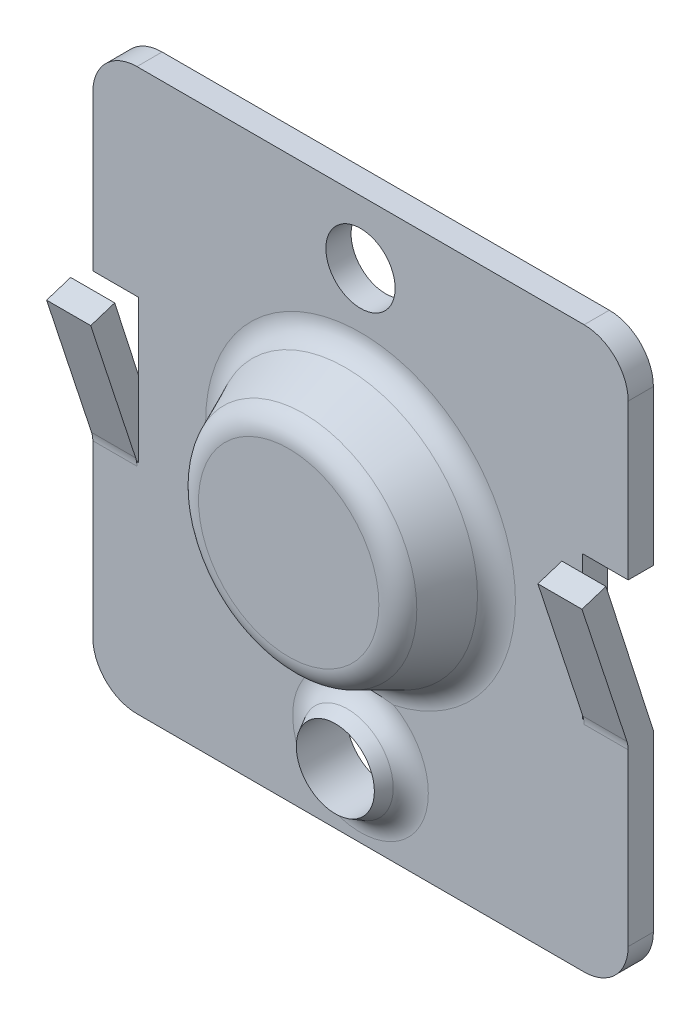
ISO-10303-21;
HEADER;
FILE_DESCRIPTION(('STEP AP214'),'2;1');
FILE_NAME('part.step','',(''),(''),'','','');
FILE_SCHEMA(('AUTOMOTIVE_DESIGN { 1 0 10303 214 1 1 1 1 }'));
ENDSEC;
DATA;
#1=APPLICATION_CONTEXT('core data for automotive mechanical design processes');
#2=APPLICATION_PROTOCOL_DEFINITION('international standard','automotive_design',2000,#1);
#3=PRODUCT_CONTEXT('',#1,'mechanical');
#4=PRODUCT('Part','Part','',(#3));
#5=PRODUCT_RELATED_PRODUCT_CATEGORY('part','',(#4));
#6=PRODUCT_DEFINITION_FORMATION('','',#4);
#7=PRODUCT_DEFINITION_CONTEXT('part definition',#1,'design');
#8=PRODUCT_DEFINITION('design','',#6,#7);
#9=PRODUCT_DEFINITION_SHAPE('','',#8);
#10=(LENGTH_UNIT() NAMED_UNIT(*) SI_UNIT(.MILLI.,.METRE.));
#11=(NAMED_UNIT(*) PLANE_ANGLE_UNIT() SI_UNIT($,.RADIAN.));
#12=(NAMED_UNIT(*) SI_UNIT($,.STERADIAN.) SOLID_ANGLE_UNIT());
#13=UNCERTAINTY_MEASURE_WITH_UNIT(LENGTH_MEASURE(1.E-05),#10,'distance_accuracy_value','');
#14=(GEOMETRIC_REPRESENTATION_CONTEXT(3) GLOBAL_UNCERTAINTY_ASSIGNED_CONTEXT((#13)) GLOBAL_UNIT_ASSIGNED_CONTEXT((#10,
#11,#12)) REPRESENTATION_CONTEXT('',''));
#15=CARTESIAN_POINT('',(0.,0.,0.));
#16=DIRECTION('',(0.,0.,1.));
#17=DIRECTION('',(1.,0.,0.));
#18=AXIS2_PLACEMENT_3D('',#15,#16,#17);
#19=CARTESIAN_POINT('',(0.889,10.414,0.508));
#20=DIRECTION('',(0.,0.,-1.));
#21=DIRECTION('',(-1.,0.,0.));
#22=AXIS2_PLACEMENT_3D('',#19,#20,#21);
#23=PLANE('',#22);
#24=CARTESIAN_POINT('',(5.3975,5.7912,0.508));
#25=DIRECTION('',(0.,0.,-1.));
#26=DIRECTION('',(-1.,0.,0.));
#27=AXIS2_PLACEMENT_3D('',#24,#25,#26);
#28=CIRCLE('',#27,3.12351811098683);
#29=CARTESIAN_POINT('',(8.52101811098683,5.7912,0.508));
#30=VERTEX_POINT('',#29);
#31=CARTESIAN_POINT('',(6.0686205800684,2.74063242056968,0.508));
#32=VERTEX_POINT('',#31);
#33=EDGE_CURVE('E334',#30,#32,#28,.T.);
#34=ORIENTED_EDGE('',*,*,#33,.T.);
#35=CARTESIAN_POINT('',(5.3975,1.5494,0.508));
#36=DIRECTION('',(0.,0.,-1.));
#37=DIRECTION('',(-1.,0.,0.));
#38=AXIS2_PLACEMENT_3D('',#35,#36,#37);
#39=CIRCLE('',#38,1.36727375196324);
#40=CARTESIAN_POINT('',(6.76477375196324,1.5494,0.508));
#41=VERTEX_POINT('',#40);
#42=EDGE_CURVE('E346',#32,#41,#39,.T.);
#43=ORIENTED_EDGE('',*,*,#42,.T.);
#44=CARTESIAN_POINT('',(5.3975,1.5494,0.508));
#45=DIRECTION('',(0.,0.,-1.));
#46=DIRECTION('',(-1.,0.,0.));
#47=AXIS2_PLACEMENT_3D('',#44,#45,#46);
#48=CIRCLE('',#47,1.36727375196324);
#49=CARTESIAN_POINT('',(4.72637941993159,2.74063242056968,0.508));
#50=VERTEX_POINT('',#49);
#51=EDGE_CURVE('E344',#41,#50,#48,.T.);
#52=ORIENTED_EDGE('',*,*,#51,.T.);
#53=CARTESIAN_POINT('',(5.3975,5.7912,0.508));
#54=DIRECTION('',(0.,0.,-1.));
#55=DIRECTION('',(-1.,0.,0.));
#56=AXIS2_PLACEMENT_3D('',#53,#54,#55);
#57=CIRCLE('',#56,3.12351811098683);
#58=EDGE_CURVE('E341',#50,#30,#57,.T.);
#59=ORIENTED_EDGE('',*,*,#58,.T.);
#60=EDGE_LOOP('',(#34,#43,#52,#59));
#61=FACE_BOUND('',#60,.T.);
#62=CARTESIAN_POINT('',(5.3975,10.033,0.508));
#63=DIRECTION('',(0.,0.,1.));
#64=DIRECTION('',(1.,0.,0.));
#65=AXIS2_PLACEMENT_3D('',#62,#63,#64);
#66=CIRCLE('',#65,0.698499999999999);
#67=CARTESIAN_POINT('',(6.096,10.033,0.508));
#68=VERTEX_POINT('',#67);
#69=EDGE_CURVE('E500',#68,#68,#66,.T.);
#70=ORIENTED_EDGE('',*,*,#69,.F.);
#71=EDGE_LOOP('',(#70));
#72=FACE_BOUND('',#71,.T.);
#73=DIRECTION('',(0.,1.,0.));
#74=VECTOR('',#73,1.);
#75=CARTESIAN_POINT('',(10.795,0.889000000000006,0.508));
#76=LINE('',#75,#74);
#77=CARTESIAN_POINT('',(10.795,0.889000000000006,0.508));
#78=VERTEX_POINT('',#77);
#79=CARTESIAN_POINT('',(10.795,4.32379097428765,0.508));
#80=VERTEX_POINT('',#79);
#81=EDGE_CURVE('E520',#78,#80,#76,.T.);
#82=ORIENTED_EDGE('',*,*,#81,.T.);
#83=DIRECTION('',(-1.,0.,0.));
#84=VECTOR('',#83,1.);
#85=CARTESIAN_POINT('',(0.889,4.32379097428765,0.508));
#86=LINE('',#85,#84);
#87=CARTESIAN_POINT('',(9.906,4.32379097428765,0.508));
#88=VERTEX_POINT('',#87);
#89=EDGE_CURVE('E355',#80,#88,#86,.T.);
#90=ORIENTED_EDGE('',*,*,#89,.T.);
#91=DIRECTION('',(0.,1.,0.));
#92=VECTOR('',#91,1.);
#93=CARTESIAN_POINT('',(9.906,10.414,0.508));
#94=LINE('',#93,#92);
#95=CARTESIAN_POINT('',(9.906,4.40500093457944,0.508));
#96=VERTEX_POINT('',#95);
#97=EDGE_CURVE('E353',#88,#96,#94,.T.);
#98=ORIENTED_EDGE('',*,*,#97,.T.);
#99=DIRECTION('',(-1.,0.,0.));
#100=VECTOR('',#99,1.);
#101=CARTESIAN_POINT('',(9.87154128838451,4.40500093457944,0.508));
#102=LINE('',#101,#100);
#103=CARTESIAN_POINT('',(9.87154128838451,4.40500093457944,0.508));
#104=VERTEX_POINT('',#103);
#105=EDGE_CURVE('E522',#96,#104,#102,.T.);
#106=ORIENTED_EDGE('',*,*,#105,.T.);
#107=DIRECTION('',(0.,1.,0.));
#108=VECTOR('',#107,1.);
#109=CARTESIAN_POINT('',(9.87154128838451,7.2898,0.508));
#110=LINE('',#109,#108);
#111=CARTESIAN_POINT('',(9.87154128838451,7.2898,0.508));
#112=VERTEX_POINT('',#111);
#113=EDGE_CURVE('E524',#104,#112,#110,.T.);
#114=ORIENTED_EDGE('',*,*,#113,.T.);
#115=DIRECTION('',(1.,0.,0.));
#116=VECTOR('',#115,1.);
#117=CARTESIAN_POINT('',(10.795,7.2898,0.508));
#118=LINE('',#117,#116);
#119=CARTESIAN_POINT('',(10.795,7.2898,0.508));
#120=VERTEX_POINT('',#119);
#121=EDGE_CURVE('E526',#112,#120,#118,.T.);
#122=ORIENTED_EDGE('',*,*,#121,.T.);
#123=DIRECTION('',(0.,1.,0.));
#124=VECTOR('',#123,1.);
#125=CARTESIAN_POINT('',(10.795,7.2898,0.508));
#126=LINE('',#125,#124);
#127=CARTESIAN_POINT('',(10.795,10.414,0.508));
#128=VERTEX_POINT('',#127);
#129=EDGE_CURVE('E528',#120,#128,#126,.T.);
#130=ORIENTED_EDGE('',*,*,#129,.T.);
#131=CARTESIAN_POINT('',(9.906,10.414,0.508));
#132=DIRECTION('',(0.,0.,1.));
#133=DIRECTION('',(-1.,0.,0.));
#134=AXIS2_PLACEMENT_3D('',#131,#132,#133);
#135=CIRCLE('',#134,0.888999999999999);
#136=CARTESIAN_POINT('',(9.90599999999999,11.303,0.508));
#137=VERTEX_POINT('',#136);
#138=EDGE_CURVE('E530',#128,#137,#135,.T.);
#139=ORIENTED_EDGE('',*,*,#138,.T.);
#140=DIRECTION('',(-1.,0.,0.));
#141=VECTOR('',#140,1.);
#142=CARTESIAN_POINT('',(0.889000000000006,11.303,0.508));
#143=LINE('',#142,#141);
#144=CARTESIAN_POINT('',(0.889000000000006,11.303,0.508));
#145=VERTEX_POINT('',#144);
#146=EDGE_CURVE('E531',#137,#145,#143,.T.);
#147=ORIENTED_EDGE('',*,*,#146,.T.);
#148=CARTESIAN_POINT('',(0.889,10.414,0.508));
#149=DIRECTION('',(0.,0.,1.));
#150=DIRECTION('',(-1.,0.,0.));
#151=AXIS2_PLACEMENT_3D('',#148,#149,#150);
#152=CIRCLE('',#151,0.889);
#153=CARTESIAN_POINT('',(0.,10.414,0.508));
#154=VERTEX_POINT('',#153);
#155=EDGE_CURVE('E452',#145,#154,#152,.T.);
#156=ORIENTED_EDGE('',*,*,#155,.T.);
#157=DIRECTION('',(0.,-1.,0.));
#158=VECTOR('',#157,1.);
#159=CARTESIAN_POINT('',(0.,7.2898,0.508));
#160=LINE('',#159,#158);
#161=CARTESIAN_POINT('',(0.,7.2898,0.508));
#162=VERTEX_POINT('',#161);
#163=EDGE_CURVE('E447',#154,#162,#160,.T.);
#164=ORIENTED_EDGE('',*,*,#163,.T.);
#165=DIRECTION('',(1.,0.,0.));
#166=VECTOR('',#165,1.);
#167=CARTESIAN_POINT('',(0.,7.2898,0.508));
#168=LINE('',#167,#166);
#169=CARTESIAN_POINT('',(0.923458711615487,7.2898,0.508));
#170=VERTEX_POINT('',#169);
#171=EDGE_CURVE('E492',#162,#170,#168,.T.);
#172=ORIENTED_EDGE('',*,*,#171,.T.);
#173=DIRECTION('',(0.,-1.,0.));
#174=VECTOR('',#173,1.);
#175=CARTESIAN_POINT('',(0.923458711615487,7.2898,0.508));
#176=LINE('',#175,#174);
#177=CARTESIAN_POINT('',(0.923458711615487,4.40500093457943,0.508));
#178=VERTEX_POINT('',#177);
#179=EDGE_CURVE('E394',#170,#178,#176,.T.);
#180=ORIENTED_EDGE('',*,*,#179,.T.);
#181=DIRECTION('',(-1.,0.,0.));
#182=VECTOR('',#181,1.);
#183=CARTESIAN_POINT('',(0.923458711615487,4.40500093457943,0.508));
#184=LINE('',#183,#182);
#185=CARTESIAN_POINT('',(0.889,4.40500093457943,0.508));
#186=VERTEX_POINT('',#185);
#187=EDGE_CURVE('E392',#178,#186,#184,.T.);
#188=ORIENTED_EDGE('',*,*,#187,.T.);
#189=DIRECTION('',(0.,-1.,0.));
#190=VECTOR('',#189,1.);
#191=CARTESIAN_POINT('',(0.889,10.414,0.508));
#192=LINE('',#191,#190);
#193=CARTESIAN_POINT('',(0.889,4.32379097428765,0.508));
#194=VERTEX_POINT('',#193);
#195=EDGE_CURVE('E61',#186,#194,#192,.T.);
#196=ORIENTED_EDGE('',*,*,#195,.T.);
#197=DIRECTION('',(-1.,0.,0.));
#198=VECTOR('',#197,1.);
#199=CARTESIAN_POINT('',(0.889,4.32379097428765,0.508));
#200=LINE('',#199,#198);
#201=CARTESIAN_POINT('',(0.,4.32379097428764,0.508));
#202=VERTEX_POINT('',#201);
#203=EDGE_CURVE('E350',#194,#202,#200,.T.);
#204=ORIENTED_EDGE('',*,*,#203,.T.);
#205=DIRECTION('',(0.,-1.,0.));
#206=VECTOR('',#205,1.);
#207=CARTESIAN_POINT('',(0.,0.889000000000006,0.508));
#208=LINE('',#207,#206);
#209=CARTESIAN_POINT('',(0.,0.889000000000006,0.508));
#210=VERTEX_POINT('',#209);
#211=EDGE_CURVE('E380',#202,#210,#208,.T.);
#212=ORIENTED_EDGE('',*,*,#211,.T.);
#213=CARTESIAN_POINT('',(0.889,0.889,0.508));
#214=DIRECTION('',(0.,0.,1.));
#215=DIRECTION('',(-1.,0.,0.));
#216=AXIS2_PLACEMENT_3D('',#213,#214,#215);
#217=CIRCLE('',#216,0.889);
#218=CARTESIAN_POINT('',(0.889000000000006,0.,0.508));
#219=VERTEX_POINT('',#218);
#220=EDGE_CURVE('E514',#210,#219,#217,.T.);
#221=ORIENTED_EDGE('',*,*,#220,.T.);
#222=DIRECTION('',(1.,0.,0.));
#223=VECTOR('',#222,1.);
#224=CARTESIAN_POINT('',(0.889000000000006,0.,0.508));
#225=LINE('',#224,#223);
#226=CARTESIAN_POINT('',(9.90599999999999,0.,0.508));
#227=VERTEX_POINT('',#226);
#228=EDGE_CURVE('E516',#219,#227,#225,.T.);
#229=ORIENTED_EDGE('',*,*,#228,.T.);
#230=CARTESIAN_POINT('',(9.906,0.889,0.508));
#231=DIRECTION('',(0.,0.,1.));
#232=DIRECTION('',(1.,0.,0.));
#233=AXIS2_PLACEMENT_3D('',#230,#231,#232);
#234=CIRCLE('',#233,0.889);
#235=EDGE_CURVE('E518',#227,#78,#234,.T.);
#236=ORIENTED_EDGE('',*,*,#235,.T.);
#237=EDGE_LOOP('',(#82,#90,#98,#106,#114,#122,#130,#139,#147,#156,#164,#172,#180,#188,#196,#204,
#212,#221,#229,#236));
#238=FACE_BOUND('',#237,.T.);
#239=ADVANCED_FACE('F41',(#61,#72,#238),#23,.F.);
#240=CARTESIAN_POINT('',(0.889,10.414,0.));
#241=DIRECTION('',(0.,0.,-1.));
#242=DIRECTION('',(-1.,0.,0.));
#243=AXIS2_PLACEMENT_3D('',#240,#241,#242);
#244=PLANE('',#243);
#245=CARTESIAN_POINT('',(5.3975,10.033,0.));
#246=DIRECTION('',(0.,0.,1.));
#247=DIRECTION('',(1.,0.,0.));
#248=AXIS2_PLACEMENT_3D('',#245,#246,#247);
#249=CIRCLE('',#248,0.698499999999999);
#250=CARTESIAN_POINT('',(6.096,10.033,0.));
#251=VERTEX_POINT('',#250);
#252=EDGE_CURVE('E504',#251,#251,#249,.T.);
#253=ORIENTED_EDGE('',*,*,#252,.T.);
#254=EDGE_LOOP('',(#253));
#255=FACE_BOUND('',#254,.T.);
#256=DIRECTION('',(0.,-1.,0.));
#257=VECTOR('',#256,1.);
#258=CARTESIAN_POINT('',(0.,7.2898,0.));
#259=LINE('',#258,#257);
#260=CARTESIAN_POINT('',(0.,10.414,0.));
#261=VERTEX_POINT('',#260);
#262=CARTESIAN_POINT('',(0.,7.2898,0.));
#263=VERTEX_POINT('',#262);
#264=EDGE_CURVE('E496',#261,#263,#259,.T.);
#265=ORIENTED_EDGE('',*,*,#264,.F.);
#266=CARTESIAN_POINT('',(0.889,10.414,0.));
#267=DIRECTION('',(0.,0.,1.));
#268=DIRECTION('',(-1.,0.,0.));
#269=AXIS2_PLACEMENT_3D('',#266,#267,#268);
#270=CIRCLE('',#269,0.889);
#271=CARTESIAN_POINT('',(0.889000000000006,11.303,0.));
#272=VERTEX_POINT('',#271);
#273=EDGE_CURVE('E445',#272,#261,#270,.T.);
#274=ORIENTED_EDGE('',*,*,#273,.F.);
#275=DIRECTION('',(-1.,0.,0.));
#276=VECTOR('',#275,1.);
#277=CARTESIAN_POINT('',(0.889000000000006,11.303,0.));
#278=LINE('',#277,#276);
#279=CARTESIAN_POINT('',(9.90599999999999,11.303,0.));
#280=VERTEX_POINT('',#279);
#281=EDGE_CURVE('E443',#280,#272,#278,.T.);
#282=ORIENTED_EDGE('',*,*,#281,.F.);
#283=CARTESIAN_POINT('',(9.906,10.414,0.));
#284=DIRECTION('',(0.,0.,1.));
#285=DIRECTION('',(-1.,0.,0.));
#286=AXIS2_PLACEMENT_3D('',#283,#284,#285);
#287=CIRCLE('',#286,0.888999999999999);
#288=CARTESIAN_POINT('',(10.795,10.414,0.));
#289=VERTEX_POINT('',#288);
#290=EDGE_CURVE('E441',#289,#280,#287,.T.);
#291=ORIENTED_EDGE('',*,*,#290,.F.);
#292=DIRECTION('',(0.,1.,0.));
#293=VECTOR('',#292,1.);
#294=CARTESIAN_POINT('',(10.795,7.2898,0.));
#295=LINE('',#294,#293);
#296=CARTESIAN_POINT('',(10.795,7.2898,0.));
#297=VERTEX_POINT('',#296);
#298=EDGE_CURVE('E439',#297,#289,#295,.T.);
#299=ORIENTED_EDGE('',*,*,#298,.F.);
#300=DIRECTION('',(1.,0.,0.));
#301=VECTOR('',#300,1.);
#302=CARTESIAN_POINT('',(10.795,7.2898,0.));
#303=LINE('',#302,#301);
#304=CARTESIAN_POINT('',(9.87154128838451,7.2898,0.));
#305=VERTEX_POINT('',#304);
#306=EDGE_CURVE('E437',#305,#297,#303,.T.);
#307=ORIENTED_EDGE('',*,*,#306,.F.);
#308=DIRECTION('',(0.,1.,0.));
#309=VECTOR('',#308,1.);
#310=CARTESIAN_POINT('',(9.87154128838451,7.2898,0.));
#311=LINE('',#310,#309);
#312=CARTESIAN_POINT('',(9.87154128838451,4.40500093457944,0.));
#313=VERTEX_POINT('',#312);
#314=EDGE_CURVE('E435',#313,#305,#311,.T.);
#315=ORIENTED_EDGE('',*,*,#314,.F.);
#316=DIRECTION('',(-1.,0.,0.));
#317=VECTOR('',#316,1.);
#318=CARTESIAN_POINT('',(9.87154128838451,4.40500093457944,0.));
#319=LINE('',#318,#317);
#320=CARTESIAN_POINT('',(9.906,4.40500093457944,0.));
#321=VERTEX_POINT('',#320);
#322=EDGE_CURVE('E431',#321,#313,#319,.T.);
#323=ORIENTED_EDGE('',*,*,#322,.F.);
#324=CARTESIAN_POINT('',(10.795,4.40500093457943,0.));
#325=VERTEX_POINT('',#324);
#326=EDGE_CURVE('E432',#325,#321,#319,.T.);
#327=ORIENTED_EDGE('',*,*,#326,.F.);
#328=DIRECTION('',(0.,1.,0.));
#329=VECTOR('',#328,1.);
#330=CARTESIAN_POINT('',(10.795,0.889000000000006,0.));
#331=LINE('',#330,#329);
#332=CARTESIAN_POINT('',(10.795,0.889000000000006,0.));
#333=VERTEX_POINT('',#332);
#334=EDGE_CURVE('E428',#333,#325,#331,.T.);
#335=ORIENTED_EDGE('',*,*,#334,.F.);
#336=CARTESIAN_POINT('',(9.906,0.889,0.));
#337=DIRECTION('',(0.,0.,1.));
#338=DIRECTION('',(1.,0.,0.));
#339=AXIS2_PLACEMENT_3D('',#336,#337,#338);
#340=CIRCLE('',#339,0.889);
#341=CARTESIAN_POINT('',(9.90599999999999,0.,0.));
#342=VERTEX_POINT('',#341);
#343=EDGE_CURVE('E426',#342,#333,#340,.T.);
#344=ORIENTED_EDGE('',*,*,#343,.F.);
#345=DIRECTION('',(1.,0.,0.));
#346=VECTOR('',#345,1.);
#347=CARTESIAN_POINT('',(0.889000000000006,0.,0.));
#348=LINE('',#347,#346);
#349=CARTESIAN_POINT('',(0.889000000000006,0.,0.));
#350=VERTEX_POINT('',#349);
#351=EDGE_CURVE('E419',#350,#342,#348,.T.);
#352=ORIENTED_EDGE('',*,*,#351,.F.);
#353=CARTESIAN_POINT('',(0.889,0.889,0.));
#354=DIRECTION('',(0.,0.,1.));
#355=DIRECTION('',(-1.,0.,0.));
#356=AXIS2_PLACEMENT_3D('',#353,#354,#355);
#357=CIRCLE('',#356,0.889);
#358=CARTESIAN_POINT('',(0.,0.889000000000006,0.));
#359=VERTEX_POINT('',#358);
#360=EDGE_CURVE('E416',#359,#350,#357,.T.);
#361=ORIENTED_EDGE('',*,*,#360,.F.);
#362=DIRECTION('',(0.,-1.,0.));
#363=VECTOR('',#362,1.);
#364=CARTESIAN_POINT('',(0.,0.889000000000006,0.));
#365=LINE('',#364,#363);
#366=CARTESIAN_POINT('',(0.,4.40500093457943,0.));
#367=VERTEX_POINT('',#366);
#368=EDGE_CURVE('E414',#367,#359,#365,.T.);
#369=ORIENTED_EDGE('',*,*,#368,.F.);
#370=DIRECTION('',(-1.,0.,0.));
#371=VECTOR('',#370,1.);
#372=CARTESIAN_POINT('',(0.889,4.40500093457943,0.));
#373=LINE('',#372,#371);
#374=CARTESIAN_POINT('',(0.889,4.40500093457943,0.));
#375=VERTEX_POINT('',#374);
#376=EDGE_CURVE('E281',#375,#367,#373,.T.);
#377=ORIENTED_EDGE('',*,*,#376,.F.);
#378=DIRECTION('',(-1.,0.,0.));
#379=VECTOR('',#378,1.);
#380=CARTESIAN_POINT('',(0.923458711615487,4.40500093457943,0.));
#381=LINE('',#380,#379);
#382=CARTESIAN_POINT('',(0.923458711615487,4.40500093457943,0.));
#383=VERTEX_POINT('',#382);
#384=EDGE_CURVE('E402',#383,#375,#381,.T.);
#385=ORIENTED_EDGE('',*,*,#384,.F.);
#386=DIRECTION('',(0.,-1.,0.));
#387=VECTOR('',#386,1.);
#388=CARTESIAN_POINT('',(0.923458711615487,7.2898,0.));
#389=LINE('',#388,#387);
#390=CARTESIAN_POINT('',(0.923458711615487,7.2898,0.));
#391=VERTEX_POINT('',#390);
#392=EDGE_CURVE('E421',#391,#383,#389,.T.);
#393=ORIENTED_EDGE('',*,*,#392,.F.);
#394=DIRECTION('',(1.,0.,0.));
#395=VECTOR('',#394,1.);
#396=CARTESIAN_POINT('',(0.,7.2898,0.));
#397=LINE('',#396,#395);
#398=EDGE_CURVE('E491',#263,#391,#397,.T.);
#399=ORIENTED_EDGE('',*,*,#398,.F.);
#400=EDGE_LOOP('',(#265,#274,#282,#291,#299,#307,#315,#323,#327,#335,#344,#352,#361,#369,#377,
#385,#393,#399));
#401=FACE_BOUND('',#400,.T.);
#402=CARTESIAN_POINT('',(5.3975,1.5494,0.));
#403=DIRECTION('',(0.,0.,1.));
#404=DIRECTION('',(1.,0.,0.));
#405=AXIS2_PLACEMENT_3D('',#402,#403,#404);
#406=CIRCLE('',#405,0.7874);
#407=CARTESIAN_POINT('',(6.1849,1.5494,0.));
#408=VERTEX_POINT('',#407);
#409=EDGE_CURVE('E297',#408,#408,#406,.T.);
#410=ORIENTED_EDGE('',*,*,#409,.T.);
#411=EDGE_LOOP('',(#410));
#412=FACE_BOUND('',#411,.T.);
#413=ADVANCED_FACE('F410',(#255,#401,#412),#244,.T.);
#414=CARTESIAN_POINT('',(0.,7.2898,0.508));
#415=DIRECTION('',(1.,0.,0.));
#416=DIRECTION('',(0.,0.,-1.));
#417=AXIS2_PLACEMENT_3D('',#414,#415,#416);
#418=PLANE('',#417);
#419=ORIENTED_EDGE('',*,*,#264,.T.);
#420=DIRECTION('',(0.,0.,-1.));
#421=VECTOR('',#420,1.);
#422=CARTESIAN_POINT('',(0.,7.2898,0.508));
#423=LINE('',#422,#421);
#424=EDGE_CURVE('E342',#162,#263,#423,.T.);
#425=ORIENTED_EDGE('',*,*,#424,.F.);
#426=ORIENTED_EDGE('',*,*,#163,.F.);
#427=DIRECTION('',(0.,0.,-1.));
#428=VECTOR('',#427,1.);
#429=CARTESIAN_POINT('',(0.,10.414,0.508));
#430=LINE('',#429,#428);
#431=EDGE_CURVE('E448',#154,#261,#430,.T.);
#432=ORIENTED_EDGE('',*,*,#431,.T.);
#433=EDGE_LOOP('',(#419,#425,#426,#432));
#434=FACE_BOUND('',#433,.T.);
#435=ADVANCED_FACE('F497',(#434),#418,.F.);
#436=CARTESIAN_POINT('',(0.,7.2898,0.508));
#437=DIRECTION('',(0.,1.,0.));
#438=DIRECTION('',(0.,0.,1.));
#439=AXIS2_PLACEMENT_3D('',#436,#437,#438);
#440=PLANE('',#439);
#441=ORIENTED_EDGE('',*,*,#398,.T.);
#442=DIRECTION('',(0.,0.,-1.));
#443=VECTOR('',#442,1.);
#444=CARTESIAN_POINT('',(0.923458711615487,7.2898,0.508));
#445=LINE('',#444,#443);
#446=EDGE_CURVE('E483',#170,#391,#445,.T.);
#447=ORIENTED_EDGE('',*,*,#446,.F.);
#448=ORIENTED_EDGE('',*,*,#171,.F.);
#449=ORIENTED_EDGE('',*,*,#424,.T.);
#450=EDGE_LOOP('',(#441,#447,#448,#449));
#451=FACE_BOUND('',#450,.T.);
#452=ADVANCED_FACE('F489',(#451),#440,.F.);
#453=CARTESIAN_POINT('',(0.923458711615487,7.2898,0.508));
#454=DIRECTION('',(1.,0.,0.));
#455=DIRECTION('',(0.,1.,0.));
#456=AXIS2_PLACEMENT_3D('',#453,#454,#455);
#457=PLANE('',#456);
#458=ORIENTED_EDGE('',*,*,#392,.T.);
#459=DIRECTION('',(0.,0.,-1.));
#460=VECTOR('',#459,1.);
#461=CARTESIAN_POINT('',(0.923458711615487,4.40500093457943,0.508));
#462=LINE('',#461,#460);
#463=EDGE_CURVE('E481',#178,#383,#462,.T.);
#464=ORIENTED_EDGE('',*,*,#463,.F.);
#465=ORIENTED_EDGE('',*,*,#179,.F.);
#466=ORIENTED_EDGE('',*,*,#446,.T.);
#467=EDGE_LOOP('',(#458,#464,#465,#466));
#468=FACE_BOUND('',#467,.T.);
#469=ADVANCED_FACE('F508',(#468),#457,.F.);
#470=CARTESIAN_POINT('',(0.923458711615487,4.40500093457943,0.508));
#471=DIRECTION('',(0.,-1.,0.));
#472=DIRECTION('',(1.,0.,0.));
#473=AXIS2_PLACEMENT_3D('',#470,#471,#472);
#474=PLANE('',#473);
#475=ORIENTED_EDGE('',*,*,#384,.T.);
#476=DIRECTION('',(0.,0.,1.));
#477=VECTOR('',#476,1.);
#478=CARTESIAN_POINT('',(0.889,4.40500093457943,0.508));
#479=LINE('',#478,#477);
#480=EDGE_CURVE('E263',#375,#186,#479,.T.);
#481=ORIENTED_EDGE('',*,*,#480,.T.);
#482=ORIENTED_EDGE('',*,*,#187,.F.);
#483=ORIENTED_EDGE('',*,*,#463,.T.);
#484=EDGE_LOOP('',(#475,#481,#482,#483));
#485=FACE_BOUND('',#484,.T.);
#486=ADVANCED_FACE('F400',(#485),#474,.F.);
#487=CARTESIAN_POINT('',(0.,0.889000000000006,0.508));
#488=DIRECTION('',(1.,0.,0.));
#489=DIRECTION('',(0.,1.,0.));
#490=AXIS2_PLACEMENT_3D('',#487,#488,#489);
#491=PLANE('',#490);
#492=ORIENTED_EDGE('',*,*,#368,.T.);
#493=DIRECTION('',(0.,0.,-1.));
#494=VECTOR('',#493,1.);
#495=CARTESIAN_POINT('',(0.,0.889000000000006,0.508));
#496=LINE('',#495,#494);
#497=EDGE_CURVE('E479',#210,#359,#496,.T.);
#498=ORIENTED_EDGE('',*,*,#497,.F.);
#499=ORIENTED_EDGE('',*,*,#211,.F.);
#500=CARTESIAN_POINT('',(0.,4.32379097428765,1.016));
#501=DIRECTION('',(1.,0.,0.));
#502=DIRECTION('',(0.,1.,0.));
#503=AXIS2_PLACEMENT_3D('',#500,#501,#502);
#504=CIRCLE('',#503,0.508);
#505=CARTESIAN_POINT('',(0.,4.48216354145977,0.533317775376687));
#506=VERTEX_POINT('',#505);
#507=EDGE_CURVE('E55',#202,#506,#504,.T.);
#508=ORIENTED_EDGE('',*,*,#507,.T.);
#509=DIRECTION('',(0.,0.950161859494711,0.311757021992373));
#510=VECTOR('',#509,1.);
#511=CARTESIAN_POINT('',(0.,7.24551707561036,1.44));
#512=LINE('',#511,#510);
#513=CARTESIAN_POINT('',(0.,7.24551707561036,1.44));
#514=VERTEX_POINT('',#513);
#515=EDGE_CURVE('E261',#506,#514,#512,.T.);
#516=ORIENTED_EDGE('',*,*,#515,.T.);
#517=DIRECTION('',(0.,0.304100244861497,-0.952640037514264));
#518=VECTOR('',#517,1.);
#519=CARTESIAN_POINT('',(0.,7.4,0.956058860942754));
#520=LINE('',#519,#518);
#521=CARTESIAN_POINT('',(0.,7.4,0.956058860942754));
#522=VERTEX_POINT('',#521);
#523=EDGE_CURVE('E277',#514,#522,#520,.T.);
#524=ORIENTED_EDGE('',*,*,#523,.T.);
#525=DIRECTION('',(0.,-0.952640037514264,-0.304100244861497));
#526=VECTOR('',#525,1.);
#527=CARTESIAN_POINT('',(0.,4.40500093457943,0.));
#528=LINE('',#527,#526);
#529=EDGE_CURVE('E267',#522,#367,#528,.T.);
#530=ORIENTED_EDGE('',*,*,#529,.T.);
#531=EDGE_LOOP('',(#492,#498,#499,#508,#516,#524,#530));
#532=FACE_BOUND('',#531,.T.);
#533=ADVANCED_FACE('F378',(#532),#491,.F.);
#534=CARTESIAN_POINT('',(0.889,0.889,0.508));
#535=DIRECTION('',(0.,0.,-1.));
#536=DIRECTION('',(-1.,0.,0.));
#537=AXIS2_PLACEMENT_3D('',#534,#535,#536);
#538=CYLINDRICAL_SURFACE('',#537,0.889);
#539=ORIENTED_EDGE('',*,*,#360,.T.);
#540=DIRECTION('',(0.,0.,-1.));
#541=VECTOR('',#540,1.);
#542=CARTESIAN_POINT('',(0.889000000000006,0.,0.508));
#543=LINE('',#542,#541);
#544=EDGE_CURVE('E476',#219,#350,#543,.T.);
#545=ORIENTED_EDGE('',*,*,#544,.F.);
#546=ORIENTED_EDGE('',*,*,#220,.F.);
#547=ORIENTED_EDGE('',*,*,#497,.T.);
#548=EDGE_LOOP('',(#539,#545,#546,#547));
#549=FACE_BOUND('',#548,.T.);
#550=ADVANCED_FACE('F590',(#549),#538,.T.);
#551=CARTESIAN_POINT('',(0.889000000000006,0.,0.508));
#552=DIRECTION('',(0.,1.,0.));
#553=DIRECTION('',(0.,0.,1.));
#554=AXIS2_PLACEMENT_3D('',#551,#552,#553);
#555=PLANE('',#554);
#556=ORIENTED_EDGE('',*,*,#351,.T.);
#557=DIRECTION('',(0.,0.,-1.));
#558=VECTOR('',#557,1.);
#559=CARTESIAN_POINT('',(9.90599999999999,0.,0.508));
#560=LINE('',#559,#558);
#561=EDGE_CURVE('E473',#227,#342,#560,.T.);
#562=ORIENTED_EDGE('',*,*,#561,.F.);
#563=ORIENTED_EDGE('',*,*,#228,.F.);
#564=ORIENTED_EDGE('',*,*,#544,.T.);
#565=EDGE_LOOP('',(#556,#562,#563,#564));
#566=FACE_BOUND('',#565,.T.);
#567=ADVANCED_FACE('F586',(#566),#555,.F.);
#568=CARTESIAN_POINT('',(9.906,0.889,0.508));
#569=DIRECTION('',(0.,0.,-1.));
#570=DIRECTION('',(-1.,0.,0.));
#571=AXIS2_PLACEMENT_3D('',#568,#569,#570);
#572=CYLINDRICAL_SURFACE('',#571,0.889);
#573=ORIENTED_EDGE('',*,*,#343,.T.);
#574=DIRECTION('',(0.,0.,-1.));
#575=VECTOR('',#574,1.);
#576=CARTESIAN_POINT('',(10.795,0.889000000000006,0.508));
#577=LINE('',#576,#575);
#578=EDGE_CURVE('E470',#78,#333,#577,.T.);
#579=ORIENTED_EDGE('',*,*,#578,.F.);
#580=ORIENTED_EDGE('',*,*,#235,.F.);
#581=ORIENTED_EDGE('',*,*,#561,.T.);
#582=EDGE_LOOP('',(#573,#579,#580,#581));
#583=FACE_BOUND('',#582,.T.);
#584=ADVANCED_FACE('F582',(#583),#572,.T.);
#585=CARTESIAN_POINT('',(10.795,0.889000000000006,0.508));
#586=DIRECTION('',(-1.,0.,0.));
#587=DIRECTION('',(0.,0.,1.));
#588=AXIS2_PLACEMENT_3D('',#585,#586,#587);
#589=PLANE('',#588);
#590=ORIENTED_EDGE('',*,*,#334,.T.);
#591=DIRECTION('',(0.,0.952640037514264,0.304100244861497));
#592=VECTOR('',#591,1.);
#593=CARTESIAN_POINT('',(10.795,4.40500093457943,0.));
#594=LINE('',#593,#592);
#595=CARTESIAN_POINT('',(10.795,7.4,0.956058860942754));
#596=VERTEX_POINT('',#595);
#597=EDGE_CURVE('E251',#325,#596,#594,.T.);
#598=ORIENTED_EDGE('',*,*,#597,.T.);
#599=DIRECTION('',(0.,-0.304100244861497,0.952640037514264));
#600=VECTOR('',#599,1.);
#601=CARTESIAN_POINT('',(10.795,7.4,0.956058860942754));
#602=LINE('',#601,#600);
#603=CARTESIAN_POINT('',(10.795,7.24551707561036,1.44));
#604=VERTEX_POINT('',#603);
#605=EDGE_CURVE('E258',#596,#604,#602,.T.);
#606=ORIENTED_EDGE('',*,*,#605,.T.);
#607=DIRECTION('',(0.,-0.950161859494711,-0.311757021992373));
#608=VECTOR('',#607,1.);
#609=CARTESIAN_POINT('',(10.795,7.24551707561036,1.44));
#610=LINE('',#609,#608);
#611=CARTESIAN_POINT('',(10.795,4.48216354145977,0.533317775376687));
#612=VERTEX_POINT('',#611);
#613=EDGE_CURVE('E232',#604,#612,#610,.T.);
#614=ORIENTED_EDGE('',*,*,#613,.T.);
#615=CARTESIAN_POINT('',(10.795,4.32379097428765,1.016));
#616=DIRECTION('',(-1.,0.,0.));
#617=DIRECTION('',(0.,0.,1.));
#618=AXIS2_PLACEMENT_3D('',#615,#616,#617);
#619=CIRCLE('',#618,0.508);
#620=EDGE_CURVE('E374',#612,#80,#619,.T.);
#621=ORIENTED_EDGE('',*,*,#620,.T.);
#622=ORIENTED_EDGE('',*,*,#81,.F.);
#623=ORIENTED_EDGE('',*,*,#578,.T.);
#624=EDGE_LOOP('',(#590,#598,#606,#614,#621,#622,#623));
#625=FACE_BOUND('',#624,.T.);
#626=ADVANCED_FACE('F578',(#625),#589,.F.);
#627=CARTESIAN_POINT('',(9.87154128838451,4.40500093457944,0.508));
#628=DIRECTION('',(0.,-1.,0.));
#629=DIRECTION('',(1.,0.,0.));
#630=AXIS2_PLACEMENT_3D('',#627,#628,#629);
#631=PLANE('',#630);
#632=ORIENTED_EDGE('',*,*,#105,.F.);
#633=DIRECTION('',(0.,0.,-1.));
#634=VECTOR('',#633,1.);
#635=CARTESIAN_POINT('',(9.906,4.40500093457943,0.508));
#636=LINE('',#635,#634);
#637=EDGE_CURVE('E248',#96,#321,#636,.T.);
#638=ORIENTED_EDGE('',*,*,#637,.T.);
#639=ORIENTED_EDGE('',*,*,#322,.T.);
#640=DIRECTION('',(0.,0.,-1.));
#641=VECTOR('',#640,1.);
#642=CARTESIAN_POINT('',(9.87154128838451,4.40500093457944,0.508));
#643=LINE('',#642,#641);
#644=EDGE_CURVE('E467',#104,#313,#643,.T.);
#645=ORIENTED_EDGE('',*,*,#644,.F.);
#646=EDGE_LOOP('',(#632,#638,#639,#645));
#647=FACE_BOUND('',#646,.T.);
#648=ADVANCED_FACE('F574',(#647),#631,.F.);
#649=CARTESIAN_POINT('',(9.87154128838451,7.2898,0.508));
#650=DIRECTION('',(-1.,0.,0.));
#651=DIRECTION('',(0.,0.,1.));
#652=AXIS2_PLACEMENT_3D('',#649,#650,#651);
#653=PLANE('',#652);
#654=ORIENTED_EDGE('',*,*,#314,.T.);
#655=DIRECTION('',(0.,0.,-1.));
#656=VECTOR('',#655,1.);
#657=CARTESIAN_POINT('',(9.87154128838451,7.2898,0.508));
#658=LINE('',#657,#656);
#659=EDGE_CURVE('E464',#112,#305,#658,.T.);
#660=ORIENTED_EDGE('',*,*,#659,.F.);
#661=ORIENTED_EDGE('',*,*,#113,.F.);
#662=ORIENTED_EDGE('',*,*,#644,.T.);
#663=EDGE_LOOP('',(#654,#660,#661,#662));
#664=FACE_BOUND('',#663,.T.);
#665=ADVANCED_FACE('F570',(#664),#653,.F.);
#666=CARTESIAN_POINT('',(10.795,7.2898,0.508));
#667=DIRECTION('',(0.,1.,0.));
#668=DIRECTION('',(0.,0.,1.));
#669=AXIS2_PLACEMENT_3D('',#666,#667,#668);
#670=PLANE('',#669);
#671=ORIENTED_EDGE('',*,*,#306,.T.);
#672=DIRECTION('',(0.,0.,-1.));
#673=VECTOR('',#672,1.);
#674=CARTESIAN_POINT('',(10.795,7.2898,0.508));
#675=LINE('',#674,#673);
#676=EDGE_CURVE('E461',#120,#297,#675,.T.);
#677=ORIENTED_EDGE('',*,*,#676,.F.);
#678=ORIENTED_EDGE('',*,*,#121,.F.);
#679=ORIENTED_EDGE('',*,*,#659,.T.);
#680=EDGE_LOOP('',(#671,#677,#678,#679));
#681=FACE_BOUND('',#680,.T.);
#682=ADVANCED_FACE('F566',(#681),#670,.F.);
#683=CARTESIAN_POINT('',(10.795,7.2898,0.508));
#684=DIRECTION('',(-1.,0.,0.));
#685=DIRECTION('',(0.,0.,1.));
#686=AXIS2_PLACEMENT_3D('',#683,#684,#685);
#687=PLANE('',#686);
#688=ORIENTED_EDGE('',*,*,#298,.T.);
#689=DIRECTION('',(0.,0.,-1.));
#690=VECTOR('',#689,1.);
#691=CARTESIAN_POINT('',(10.795,10.414,0.508));
#692=LINE('',#691,#690);
#693=EDGE_CURVE('E458',#128,#289,#692,.T.);
#694=ORIENTED_EDGE('',*,*,#693,.F.);
#695=ORIENTED_EDGE('',*,*,#129,.F.);
#696=ORIENTED_EDGE('',*,*,#676,.T.);
#697=EDGE_LOOP('',(#688,#694,#695,#696));
#698=FACE_BOUND('',#697,.T.);
#699=ADVANCED_FACE('F562',(#698),#687,.F.);
#700=CARTESIAN_POINT('',(9.906,10.414,0.508));
#701=DIRECTION('',(0.,0.,-1.));
#702=DIRECTION('',(-1.,0.,0.));
#703=AXIS2_PLACEMENT_3D('',#700,#701,#702);
#704=CYLINDRICAL_SURFACE('',#703,0.888999999999999);
#705=ORIENTED_EDGE('',*,*,#290,.T.);
#706=DIRECTION('',(0.,0.,-1.));
#707=VECTOR('',#706,1.);
#708=CARTESIAN_POINT('',(9.90599999999999,11.303,0.508));
#709=LINE('',#708,#707);
#710=EDGE_CURVE('E455',#137,#280,#709,.T.);
#711=ORIENTED_EDGE('',*,*,#710,.F.);
#712=ORIENTED_EDGE('',*,*,#138,.F.);
#713=ORIENTED_EDGE('',*,*,#693,.T.);
#714=EDGE_LOOP('',(#705,#711,#712,#713));
#715=FACE_BOUND('',#714,.T.);
#716=ADVANCED_FACE('F558',(#715),#704,.T.);
#717=CARTESIAN_POINT('',(0.889000000000006,11.303,0.508));
#718=DIRECTION('',(0.,-1.,0.));
#719=DIRECTION('',(0.,0.,-1.));
#720=AXIS2_PLACEMENT_3D('',#717,#718,#719);
#721=PLANE('',#720);
#722=ORIENTED_EDGE('',*,*,#281,.T.);
#723=DIRECTION('',(0.,0.,-1.));
#724=VECTOR('',#723,1.);
#725=CARTESIAN_POINT('',(0.889000000000006,11.303,0.508));
#726=LINE('',#725,#724);
#727=EDGE_CURVE('E451',#145,#272,#726,.T.);
#728=ORIENTED_EDGE('',*,*,#727,.F.);
#729=ORIENTED_EDGE('',*,*,#146,.F.);
#730=ORIENTED_EDGE('',*,*,#710,.T.);
#731=EDGE_LOOP('',(#722,#728,#729,#730));
#732=FACE_BOUND('',#731,.T.);
#733=ADVANCED_FACE('F555',(#732),#721,.F.);
#734=CARTESIAN_POINT('',(0.889,10.414,0.508));
#735=DIRECTION('',(0.,0.,-1.));
#736=DIRECTION('',(-1.,0.,0.));
#737=AXIS2_PLACEMENT_3D('',#734,#735,#736);
#738=CYLINDRICAL_SURFACE('',#737,0.889);
#739=ORIENTED_EDGE('',*,*,#273,.T.);
#740=ORIENTED_EDGE('',*,*,#431,.F.);
#741=ORIENTED_EDGE('',*,*,#155,.F.);
#742=ORIENTED_EDGE('',*,*,#727,.T.);
#743=EDGE_LOOP('',(#739,#740,#741,#742));
#744=FACE_BOUND('',#743,.T.);
#745=ADVANCED_FACE('F536',(#744),#738,.T.);
#746=CARTESIAN_POINT('',(5.3975,10.033,0.508));
#747=DIRECTION('',(0.,0.,-1.));
#748=DIRECTION('',(-1.,0.,0.));
#749=AXIS2_PLACEMENT_3D('',#746,#747,#748);
#750=CYLINDRICAL_SURFACE('',#749,0.698499999999999);
#751=ORIENTED_EDGE('',*,*,#69,.T.);
#752=EDGE_LOOP('',(#751));
#753=FACE_BOUND('',#752,.T.);
#754=ORIENTED_EDGE('',*,*,#252,.F.);
#755=EDGE_LOOP('',(#754));
#756=FACE_BOUND('',#755,.T.);
#757=ADVANCED_FACE('F325',(#753,#756),#750,.F.);
#758=CARTESIAN_POINT('',(5.3975,1.5494,0.508));
#759=DIRECTION('',(0.,0.,-1.));
#760=DIRECTION('',(-1.,0.,0.));
#761=AXIS2_PLACEMENT_3D('',#758,#759,#760);
#762=CYLINDRICAL_SURFACE('',#761,0.7874);
#763=ORIENTED_EDGE('',*,*,#409,.F.);
#764=EDGE_LOOP('',(#763));
#765=FACE_BOUND('',#764,.T.);
#766=CARTESIAN_POINT('',(5.3975,1.5494,1.016));
#767=DIRECTION('',(0.,0.,1.));
#768=DIRECTION('',(1.,0.,0.));
#769=AXIS2_PLACEMENT_3D('',#766,#767,#768);
#770=CIRCLE('',#769,0.7874);
#771=CARTESIAN_POINT('',(6.1849,1.5494,1.016));
#772=VERTEX_POINT('',#771);
#773=EDGE_CURVE('E284',#772,#772,#770,.T.);
#774=ORIENTED_EDGE('',*,*,#773,.T.);
#775=EDGE_LOOP('',(#774));
#776=FACE_BOUND('',#775,.T.);
#777=ADVANCED_FACE('F320',(#765,#776),#762,.F.);
#778=CARTESIAN_POINT('',(5.3975,5.7912,1.9558));
#779=DIRECTION('',(0.,0.,1.));
#780=DIRECTION('',(1.,0.,0.));
#781=AXIS2_PLACEMENT_3D('',#778,#779,#780);
#782=PLANE('',#781);
#783=CARTESIAN_POINT('',(5.3975,5.7912,1.9558));
#784=DIRECTION('',(0.,0.,1.));
#785=DIRECTION('',(1.,0.,0.));
#786=AXIS2_PLACEMENT_3D('',#783,#784,#785);
#787=CIRCLE('',#786,1.81804826789986);
#788=CARTESIAN_POINT('',(7.21554826789986,5.7912,1.9558));
#789=VERTEX_POINT('',#788);
#790=EDGE_CURVE('E364',#789,#789,#787,.T.);
#791=ORIENTED_EDGE('',*,*,#790,.T.);
#792=EDGE_LOOP('',(#791));
#793=FACE_BOUND('',#792,.T.);
#794=ADVANCED_FACE('F316',(#793),#782,.T.);
#795=CARTESIAN_POINT('',(5.3975,5.7912,1.9558));
#796=DIRECTION('',(0.,0.,-1.));
#797=DIRECTION('',(-1.,0.,0.));
#798=AXIS2_PLACEMENT_3D('',#795,#796,#797);
#799=CONICAL_SURFACE('',#798,2.14756637888669,0.419934285779463);
#800=CARTESIAN_POINT('',(5.3975,5.7912,1.65491182821961));
#801=DIRECTION('',(0.,0.,1.));
#802=DIRECTION('',(1.,0.,0.));
#803=AXIS2_PLACEMENT_3D('',#800,#801,#802);
#804=CIRCLE('',#803,2.28191106077242);
#805=CARTESIAN_POINT('',(7.67941106077242,5.7912,1.65491182821961));
#806=VERTEX_POINT('',#805);
#807=EDGE_CURVE('E370',#806,#806,#804,.F.);
#808=ORIENTED_EDGE('',*,*,#807,.T.);
#809=EDGE_LOOP('',(#808));
#810=FACE_BOUND('',#809,.T.);
#811=CARTESIAN_POINT('',(5.3975,5.7912,0.808888171780394));
#812=DIRECTION('',(0.,0.,1.));
#813=DIRECTION('',(1.,0.,0.));
#814=AXIS2_PLACEMENT_3D('',#811,#812,#813);
#815=CIRCLE('',#814,2.65965531811427);
#816=CARTESIAN_POINT('',(8.05715531811427,5.7912,0.808888171780394));
#817=VERTEX_POINT('',#816);
#818=EDGE_CURVE('E367',#817,#817,#815,.T.);
#819=ORIENTED_EDGE('',*,*,#818,.T.);
#820=EDGE_LOOP('',(#819));
#821=FACE_BOUND('',#820,.T.);
#822=ADVANCED_FACE('F310',(#810,#821),#799,.T.);
#823=CARTESIAN_POINT('',(5.3975,1.5494,1.016));
#824=DIRECTION('',(0.,0.,-1.));
#825=DIRECTION('',(-1.,0.,0.));
#826=AXIS2_PLACEMENT_3D('',#823,#824,#825);
#827=CONICAL_SURFACE('',#826,0.7874,0.503181649678975);
#828=CARTESIAN_POINT('',(5.3975,1.5494,0.771034644066994));
#829=DIRECTION('',(0.,0.,1.));
#830=DIRECTION('',(1.,0.,0.));
#831=AXIS2_PLACEMENT_3D('',#828,#829,#830);
#832=CIRCLE('',#831,0.922238950635735);
#833=CARTESIAN_POINT('',(6.31973895063573,1.5494,0.771034644066994));
#834=VERTEX_POINT('',#833);
#835=EDGE_CURVE('E361',#834,#834,#832,.T.);
#836=ORIENTED_EDGE('',*,*,#835,.T.);
#837=EDGE_LOOP('',(#836));
#838=FACE_BOUND('',#837,.T.);
#839=ORIENTED_EDGE('',*,*,#773,.F.);
#840=EDGE_LOOP('',(#839));
#841=FACE_BOUND('',#840,.T.);
#842=ADVANCED_FACE('F299',(#838,#841),#827,.T.);
#843=CARTESIAN_POINT('',(0.889,4.40500093457943,0.));
#844=DIRECTION('',(0.,0.304100244861497,-0.952640037514264));
#845=DIRECTION('',(0.,0.952640037514264,0.304100244861497));
#846=AXIS2_PLACEMENT_3D('',#843,#844,#845);
#847=PLANE('',#846);
#848=ORIENTED_EDGE('',*,*,#529,.F.);
#849=DIRECTION('',(-1.,0.,0.));
#850=VECTOR('',#849,1.);
#851=CARTESIAN_POINT('',(0.889,7.4,0.956058860942754));
#852=LINE('',#851,#850);
#853=CARTESIAN_POINT('',(0.889,7.4,0.956058860942754));
#854=VERTEX_POINT('',#853);
#855=EDGE_CURVE('E285',#854,#522,#852,.T.);
#856=ORIENTED_EDGE('',*,*,#855,.F.);
#857=DIRECTION('',(0.,-0.952640037514264,-0.304100244861497));
#858=VECTOR('',#857,1.);
#859=CARTESIAN_POINT('',(0.889,4.40500093457943,0.));
#860=LINE('',#859,#858);
#861=EDGE_CURVE('E272',#854,#375,#860,.T.);
#862=ORIENTED_EDGE('',*,*,#861,.T.);
#863=ORIENTED_EDGE('',*,*,#376,.T.);
#864=EDGE_LOOP('',(#848,#856,#862,#863));
#865=FACE_BOUND('',#864,.T.);
#866=ADVANCED_FACE('F309',(#865),#847,.T.);
#867=CARTESIAN_POINT('',(0.889,7.4,0.956058860942754));
#868=DIRECTION('',(0.,0.952640037514264,0.304100244861497));
#869=DIRECTION('',(0.,-0.304100244861497,0.952640037514264));
#870=AXIS2_PLACEMENT_3D('',#867,#868,#869);
#871=PLANE('',#870);
#872=ORIENTED_EDGE('',*,*,#523,.F.);
#873=DIRECTION('',(-1.,0.,0.));
#874=VECTOR('',#873,1.);
#875=CARTESIAN_POINT('',(0.889,7.24551707561036,1.44));
#876=LINE('',#875,#874);
#877=CARTESIAN_POINT('',(0.889,7.24551707561036,1.44));
#878=VERTEX_POINT('',#877);
#879=EDGE_CURVE('E275',#878,#514,#876,.T.);
#880=ORIENTED_EDGE('',*,*,#879,.F.);
#881=DIRECTION('',(0.,0.304100244861497,-0.952640037514264));
#882=VECTOR('',#881,1.);
#883=CARTESIAN_POINT('',(0.889,7.4,0.956058860942754));
#884=LINE('',#883,#882);
#885=EDGE_CURVE('E269',#878,#854,#884,.T.);
#886=ORIENTED_EDGE('',*,*,#885,.T.);
#887=ORIENTED_EDGE('',*,*,#855,.T.);
#888=EDGE_LOOP('',(#872,#880,#886,#887));
#889=FACE_BOUND('',#888,.T.);
#890=ADVANCED_FACE('F662',(#889),#871,.T.);
#891=CARTESIAN_POINT('',(0.889,7.24551707561036,1.44));
#892=DIRECTION('',(0.,-0.311757021992373,0.950161859494711));
#893=DIRECTION('',(0.,-0.950161859494711,-0.311757021992373));
#894=AXIS2_PLACEMENT_3D('',#891,#892,#893);
#895=PLANE('',#894);
#896=ORIENTED_EDGE('',*,*,#515,.F.);
#897=DIRECTION('',(-1.,0.,0.));
#898=VECTOR('',#897,1.);
#899=CARTESIAN_POINT('',(0.889,4.48216354145977,0.533317775376687));
#900=LINE('',#899,#898);
#901=CARTESIAN_POINT('',(0.889,4.48216354145977,0.533317775376687));
#902=VERTEX_POINT('',#901);
#903=EDGE_CURVE('E69',#506,#902,#900,.F.);
#904=ORIENTED_EDGE('',*,*,#903,.T.);
#905=DIRECTION('',(0.,0.950161859494711,0.311757021992373));
#906=VECTOR('',#905,1.);
#907=CARTESIAN_POINT('',(0.889,7.24551707561036,1.44));
#908=LINE('',#907,#906);
#909=EDGE_CURVE('E266',#902,#878,#908,.T.);
#910=ORIENTED_EDGE('',*,*,#909,.T.);
#911=ORIENTED_EDGE('',*,*,#879,.T.);
#912=EDGE_LOOP('',(#896,#904,#910,#911));
#913=FACE_BOUND('',#912,.T.);
#914=ADVANCED_FACE('F312',(#913),#895,.T.);
#915=CARTESIAN_POINT('',(0.889,4.40500093457943,0.));
#916=DIRECTION('',(1.,0.,0.));
#917=DIRECTION('',(0.,0.,-1.));
#918=AXIS2_PLACEMENT_3D('',#915,#916,#917);
#919=PLANE('',#918);
#920=ORIENTED_EDGE('',*,*,#480,.F.);
#921=ORIENTED_EDGE('',*,*,#861,.F.);
#922=ORIENTED_EDGE('',*,*,#885,.F.);
#923=ORIENTED_EDGE('',*,*,#909,.F.);
#924=CARTESIAN_POINT('',(0.889,4.32379097428765,1.016));
#925=DIRECTION('',(1.,0.,0.));
#926=DIRECTION('',(0.,0.,-1.));
#927=AXIS2_PLACEMENT_3D('',#924,#925,#926);
#928=CIRCLE('',#927,0.508);
#929=EDGE_CURVE('E12',#902,#194,#928,.F.);
#930=ORIENTED_EDGE('',*,*,#929,.T.);
#931=ORIENTED_EDGE('',*,*,#195,.F.);
#932=EDGE_LOOP('',(#920,#921,#922,#923,#930,#931));
#933=FACE_BOUND('',#932,.T.);
#934=ADVANCED_FACE('F387',(#933),#919,.T.);
#935=CARTESIAN_POINT('',(9.906,7.4,0.956058860942754));
#936=DIRECTION('',(0.,0.952640037514264,0.304100244861497));
#937=DIRECTION('',(0.,-0.304100244861497,0.952640037514264));
#938=AXIS2_PLACEMENT_3D('',#935,#936,#937);
#939=PLANE('',#938);
#940=ORIENTED_EDGE('',*,*,#605,.F.);
#941=DIRECTION('',(1.,0.,0.));
#942=VECTOR('',#941,1.);
#943=CARTESIAN_POINT('',(9.906,7.4,0.956058860942754));
#944=LINE('',#943,#942);
#945=CARTESIAN_POINT('',(9.906,7.4,0.956058860942754));
#946=VERTEX_POINT('',#945);
#947=EDGE_CURVE('E237',#946,#596,#944,.T.);
#948=ORIENTED_EDGE('',*,*,#947,.F.);
#949=DIRECTION('',(0.,-0.304100244861497,0.952640037514264));
#950=VECTOR('',#949,1.);
#951=CARTESIAN_POINT('',(9.906,7.4,0.956058860942754));
#952=LINE('',#951,#950);
#953=CARTESIAN_POINT('',(9.906,7.24551707561036,1.44));
#954=VERTEX_POINT('',#953);
#955=EDGE_CURVE('E244',#946,#954,#952,.T.);
#956=ORIENTED_EDGE('',*,*,#955,.T.);
#957=DIRECTION('',(1.,0.,0.));
#958=VECTOR('',#957,1.);
#959=CARTESIAN_POINT('',(9.906,7.24551707561036,1.44));
#960=LINE('',#959,#958);
#961=EDGE_CURVE('E226',#954,#604,#960,.T.);
#962=ORIENTED_EDGE('',*,*,#961,.T.);
#963=EDGE_LOOP('',(#940,#948,#956,#962));
#964=FACE_BOUND('',#963,.T.);
#965=ADVANCED_FACE('F250',(#964),#939,.T.);
#966=CARTESIAN_POINT('',(9.906,4.40500093457943,0.));
#967=DIRECTION('',(0.,0.304100244861497,-0.952640037514264));
#968=DIRECTION('',(0.,0.952640037514264,0.304100244861497));
#969=AXIS2_PLACEMENT_3D('',#966,#967,#968);
#970=PLANE('',#969);
#971=ORIENTED_EDGE('',*,*,#597,.F.);
#972=ORIENTED_EDGE('',*,*,#326,.T.);
#973=DIRECTION('',(0.,0.952640037514264,0.304100244861497));
#974=VECTOR('',#973,1.);
#975=CARTESIAN_POINT('',(9.906,4.40500093457943,0.));
#976=LINE('',#975,#974);
#977=EDGE_CURVE('E238',#321,#946,#976,.T.);
#978=ORIENTED_EDGE('',*,*,#977,.T.);
#979=ORIENTED_EDGE('',*,*,#947,.T.);
#980=EDGE_LOOP('',(#971,#972,#978,#979));
#981=FACE_BOUND('',#980,.T.);
#982=ADVANCED_FACE('F686',(#981),#970,.T.);
#983=CARTESIAN_POINT('',(9.906,7.24551707561036,1.44));
#984=DIRECTION('',(0.,-0.311757021992373,0.950161859494711));
#985=DIRECTION('',(0.,-0.950161859494711,-0.311757021992373));
#986=AXIS2_PLACEMENT_3D('',#983,#984,#985);
#987=PLANE('',#986);
#988=DIRECTION('',(0.,-0.950161859494711,-0.311757021992373));
#989=VECTOR('',#988,1.);
#990=CARTESIAN_POINT('',(9.906,7.24551707561036,1.44));
#991=LINE('',#990,#989);
#992=CARTESIAN_POINT('',(9.906,4.48216354145977,0.533317775376687));
#993=VERTEX_POINT('',#992);
#994=EDGE_CURVE('E229',#954,#993,#991,.T.);
#995=ORIENTED_EDGE('',*,*,#994,.T.);
#996=DIRECTION('',(-1.,0.,0.));
#997=VECTOR('',#996,1.);
#998=CARTESIAN_POINT('',(9.906,4.48216354145977,0.533317775376687));
#999=LINE('',#998,#997);
#1000=EDGE_CURVE('E358',#993,#612,#999,.F.);
#1001=ORIENTED_EDGE('',*,*,#1000,.T.);
#1002=ORIENTED_EDGE('',*,*,#613,.F.);
#1003=ORIENTED_EDGE('',*,*,#961,.F.);
#1004=EDGE_LOOP('',(#995,#1001,#1002,#1003));
#1005=FACE_BOUND('',#1004,.T.);
#1006=ADVANCED_FACE('F228',(#1005),#987,.T.);
#1007=CARTESIAN_POINT('',(9.906,7.4,0.956058860942754));
#1008=DIRECTION('',(-1.,0.,0.));
#1009=DIRECTION('',(0.,0.,1.));
#1010=AXIS2_PLACEMENT_3D('',#1007,#1008,#1009);
#1011=PLANE('',#1010);
#1012=ORIENTED_EDGE('',*,*,#955,.F.);
#1013=ORIENTED_EDGE('',*,*,#977,.F.);
#1014=ORIENTED_EDGE('',*,*,#637,.F.);
#1015=ORIENTED_EDGE('',*,*,#97,.F.);
#1016=CARTESIAN_POINT('',(9.906,4.32379097428765,1.016));
#1017=DIRECTION('',(-1.,0.,0.));
#1018=DIRECTION('',(0.,0.,1.));
#1019=AXIS2_PLACEMENT_3D('',#1016,#1017,#1018);
#1020=CIRCLE('',#1019,0.508);
#1021=EDGE_CURVE('E247',#88,#993,#1020,.F.);
#1022=ORIENTED_EDGE('',*,*,#1021,.T.);
#1023=ORIENTED_EDGE('',*,*,#994,.F.);
#1024=EDGE_LOOP('',(#1012,#1013,#1014,#1015,#1022,#1023));
#1025=FACE_BOUND('',#1024,.T.);
#1026=ADVANCED_FACE('F242',(#1025),#1011,.T.);
#1027=CARTESIAN_POINT('',(0.889,4.32379097428765,1.016));
#1028=DIRECTION('',(-1.,0.,0.));
#1029=DIRECTION('',(0.,0.,1.));
#1030=AXIS2_PLACEMENT_3D('',#1027,#1028,#1029);
#1031=CYLINDRICAL_SURFACE('',#1030,0.508);
#1032=ORIENTED_EDGE('',*,*,#620,.F.);
#1033=ORIENTED_EDGE('',*,*,#1000,.F.);
#1034=ORIENTED_EDGE('',*,*,#1021,.F.);
#1035=ORIENTED_EDGE('',*,*,#89,.F.);
#1036=EDGE_LOOP('',(#1032,#1033,#1034,#1035));
#1037=FACE_BOUND('',#1036,.T.);
#1038=ADVANCED_FACE('F603',(#1037),#1031,.F.);
#1039=CARTESIAN_POINT('',(0.889,4.32379097428765,1.016));
#1040=DIRECTION('',(-1.,0.,0.));
#1041=DIRECTION('',(0.,0.,1.));
#1042=AXIS2_PLACEMENT_3D('',#1039,#1040,#1041);
#1043=CYLINDRICAL_SURFACE('',#1042,0.508);
#1044=ORIENTED_EDGE('',*,*,#929,.F.);
#1045=ORIENTED_EDGE('',*,*,#903,.F.);
#1046=ORIENTED_EDGE('',*,*,#507,.F.);
#1047=ORIENTED_EDGE('',*,*,#203,.F.);
#1048=EDGE_LOOP('',(#1044,#1045,#1046,#1047));
#1049=FACE_BOUND('',#1048,.T.);
#1050=ADVANCED_FACE('F386',(#1049),#1043,.F.);
#1051=CARTESIAN_POINT('',(5.3975,5.7912,1.016));
#1052=DIRECTION('',(0.,0.,-1.));
#1053=DIRECTION('',(-1.,0.,0.));
#1054=AXIS2_PLACEMENT_3D('',#1051,#1052,#1053);
#1055=TOROIDAL_SURFACE('',#1054,3.12351811098683,0.508);
#1056=ORIENTED_EDGE('',*,*,#818,.F.);
#1057=EDGE_LOOP('',(#1056));
#1058=FACE_BOUND('',#1057,.T.);
#1059=CARTESIAN_POINT('',(4.72637941993159,2.74063242056968,0.507999999999985));
#1060=CARTESIAN_POINT('',(4.72819963917775,2.74090427694641,0.508000026794216));
#1061=CARTESIAN_POINT('',(4.73002000672066,2.74117516468191,0.508001298729357));
#1062=CARTESIAN_POINT('',(4.81629055321886,2.75396595663652,0.508119444635051));
#1063=CARTESIAN_POINT('',(4.90105687555549,2.76439634910734,0.510862987670817));
#1064=CARTESIAN_POINT('',(5.02850869862236,2.77648296597655,0.515340150749121));
#1065=CARTESIAN_POINT('',(5.07105519854548,2.77991914787627,0.516893340814389));
#1066=CARTESIAN_POINT('',(5.156240059073,2.785554905964,0.519672376191851));
#1067=CARTESIAN_POINT('',(5.19887840522236,2.78775466423924,0.520898269690811));
#1068=CARTESIAN_POINT('',(5.28422951785375,2.79088061138466,0.522694722137343));
#1069=CARTESIAN_POINT('',(5.32694230367758,2.79180639536314,0.523265072732232));
#1070=CARTESIAN_POINT('',(5.4123811819298,2.79236667020888,0.523606279004987));
#1071=CARTESIAN_POINT('',(5.45510727464663,2.79200113080786,0.523377115942466));
#1072=CARTESIAN_POINT('',(5.54051359007196,2.78998542236019,0.522176856889024));
#1073=CARTESIAN_POINT('',(5.58319381656958,2.78833536916529,0.521205827807991));
#1074=CARTESIAN_POINT('',(5.66847072714617,2.78377959249798,0.518772176706884));
#1075=CARTESIAN_POINT('',(5.71106741337593,2.78087390179032,0.51730956751438));
#1076=CARTESIAN_POINT('',(5.77949807997236,2.7752278686996,0.514892005926464));
#1077=CARTESIAN_POINT('',(5.8053650507489,2.77286824562957,0.51396251092714));
#1078=CARTESIAN_POINT('',(5.85705502632494,2.76771483057437,0.512189649020094));
#1079=CARTESIAN_POINT('',(5.88287803570774,2.76492108705903,0.511346272514587));
#1080=CARTESIAN_POINT('',(5.96026522169928,2.7559111169161,0.509131577091942));
#1081=CARTESIAN_POINT('',(6.0117710478645,2.74906418788994,0.50807464114896));
#1082=CARTESIAN_POINT('',(6.0649799937805,2.74117516225342,0.508001281952629));
#1083=CARTESIAN_POINT('',(6.06680036147208,2.74090427443468,0.508000009586755));
#1084=CARTESIAN_POINT('',(6.0686205800684,2.74063242056968,0.507999999999998));
#1085=B_SPLINE_CURVE_WITH_KNOTS('',3,(#1059,#1060,#1061,#1062,#1063,#1064,#1065,#1066,#1067,
#1068,#1069,#1070,#1071,#1072,#1073,#1074,#1075,#1076,#1077,#1078,#1079,#1080,#1081,#1082,#1083,
#1084),.UNSPECIFIED.,.F.,.F.,(4,2,2,2,2,2,2,2,2,2,2,2,4),(0.,0.00552123707574416,
0.261640394748156,0.389773030564833,0.517886791432025,0.646041259735545,0.77419873196604,
0.902344646867089,1.030487218116,1.10845641993084,1.18641692268086,1.34226716597812,
1.34778840305514),.UNSPECIFIED.);
#1086=EDGE_CURVE('E45',#32,#50,#1085,.F.);
#1087=ORIENTED_EDGE('',*,*,#1086,.F.);
#1088=ORIENTED_EDGE('',*,*,#33,.F.);
#1089=ORIENTED_EDGE('',*,*,#58,.F.);
#1090=EDGE_LOOP('',(#1087,#1088,#1089));
#1091=FACE_BOUND('',#1090,.T.);
#1092=ADVANCED_FACE('F608',(#1058,#1091),#1055,.F.);
#1093=CARTESIAN_POINT('',(5.3975,1.5494,1.016));
#1094=DIRECTION('',(0.,0.,-1.));
#1095=DIRECTION('',(-1.,0.,0.));
#1096=AXIS2_PLACEMENT_3D('',#1093,#1094,#1095);
#1097=TOROIDAL_SURFACE('',#1096,1.36727375196324,0.508);
#1098=ORIENTED_EDGE('',*,*,#42,.F.);
#1099=ORIENTED_EDGE('',*,*,#1086,.T.);
#1100=ORIENTED_EDGE('',*,*,#51,.F.);
#1101=EDGE_LOOP('',(#1098,#1099,#1100));
#1102=FACE_BOUND('',#1101,.T.);
#1103=ORIENTED_EDGE('',*,*,#835,.F.);
#1104=EDGE_LOOP('',(#1103));
#1105=FACE_BOUND('',#1104,.T.);
#1106=ADVANCED_FACE('F612',(#1102,#1105),#1097,.F.);
#1107=CARTESIAN_POINT('',(5.3975,5.7912,1.4478));
#1108=DIRECTION('',(0.,0.,1.));
#1109=DIRECTION('',(1.,0.,0.));
#1110=AXIS2_PLACEMENT_3D('',#1107,#1108,#1109);
#1111=TOROIDAL_SURFACE('',#1110,1.81804826789986,0.508);
#1112=ORIENTED_EDGE('',*,*,#807,.F.);
#1113=EDGE_LOOP('',(#1112));
#1114=FACE_BOUND('',#1113,.T.);
#1115=ORIENTED_EDGE('',*,*,#790,.F.);
#1116=EDGE_LOOP('',(#1115));
#1117=FACE_BOUND('',#1116,.T.);
#1118=ADVANCED_FACE('F43',(#1114,#1117),#1111,.T.);
#1119=CLOSED_SHELL('',(#239,#413,#435,#452,#469,#486,#533,#550,#567,#584,#626,#648,#665,#682,
#699,#716,#733,#745,#757,#777,#794,#822,#842,#866,#890,#914,#934,#965,#982,#1006,#1026,#1038,
#1050,#1092,#1106,#1118));
#1120=MANIFOLD_SOLID_BREP('B2',#1119);
#1121=ADVANCED_BREP_SHAPE_REPRESENTATION('',(#18,#1120),#14);
#1122=SHAPE_DEFINITION_REPRESENTATION(#9,#1121);
ENDSEC;
END-ISO-10303-21;
